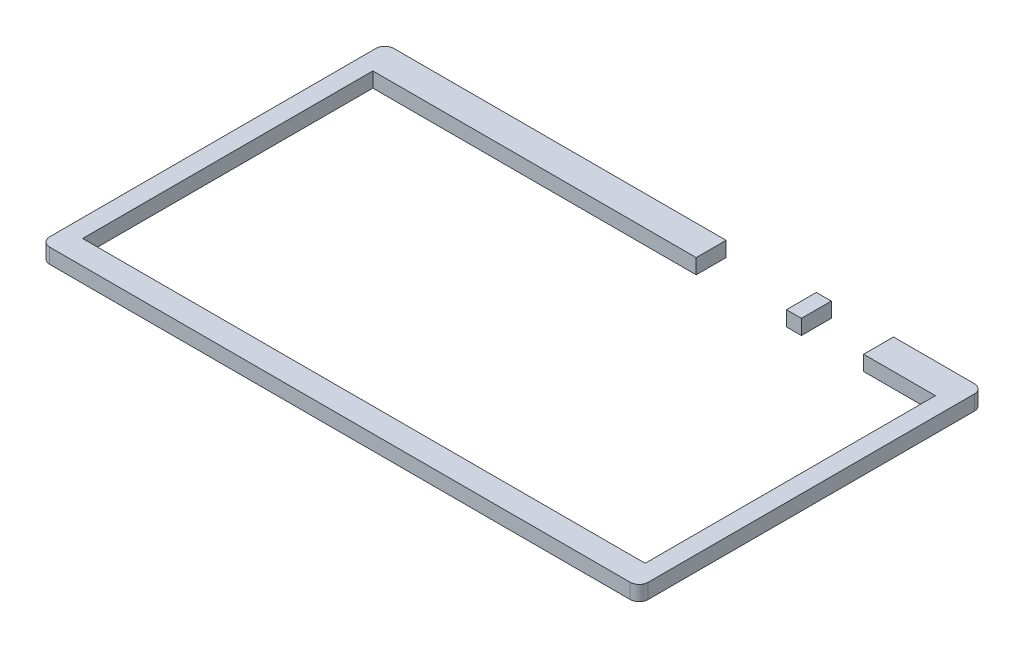
ISO-10303-21;
HEADER;
FILE_DESCRIPTION(('STEP AP214'),'2;1');
FILE_NAME('part.step','',(''),(''),'','','');
FILE_SCHEMA(('AUTOMOTIVE_DESIGN { 1 0 10303 214 1 1 1 1 }'));
ENDSEC;
DATA;
#1=APPLICATION_CONTEXT('core data for automotive mechanical design processes');
#2=APPLICATION_PROTOCOL_DEFINITION('international standard','automotive_design',2000,#1);
#3=PRODUCT_CONTEXT('',#1,'mechanical');
#4=PRODUCT('Part','Part','',(#3));
#5=PRODUCT_RELATED_PRODUCT_CATEGORY('part','',(#4));
#6=PRODUCT_DEFINITION_FORMATION('','',#4);
#7=PRODUCT_DEFINITION_CONTEXT('part definition',#1,'design');
#8=PRODUCT_DEFINITION('design','',#6,#7);
#9=PRODUCT_DEFINITION_SHAPE('','',#8);
#10=(LENGTH_UNIT() NAMED_UNIT(*) SI_UNIT(.MILLI.,.METRE.));
#11=(NAMED_UNIT(*) PLANE_ANGLE_UNIT() SI_UNIT($,.RADIAN.));
#12=(NAMED_UNIT(*) SI_UNIT($,.STERADIAN.) SOLID_ANGLE_UNIT());
#13=UNCERTAINTY_MEASURE_WITH_UNIT(LENGTH_MEASURE(1.E-05),#10,'distance_accuracy_value','');
#14=(GEOMETRIC_REPRESENTATION_CONTEXT(3) GLOBAL_UNCERTAINTY_ASSIGNED_CONTEXT((#13)) GLOBAL_UNIT_ASSIGNED_CONTEXT((#10,
#11,#12)) REPRESENTATION_CONTEXT('',''));
#15=CARTESIAN_POINT('',(0.,0.,0.));
#16=DIRECTION('',(0.,0.,1.));
#17=DIRECTION('',(1.,0.,0.));
#18=AXIS2_PLACEMENT_3D('',#15,#16,#17);
#19=CARTESIAN_POINT('',(189.5,6.35,-146.05));
#20=DIRECTION('',(-1.,0.,0.));
#21=DIRECTION('',(0.,0.,1.));
#22=AXIS2_PLACEMENT_3D('',#19,#20,#21);
#23=PLANE('',#22);
#24=DIRECTION('',(0.,0.,-1.));
#25=VECTOR('',#24,1.);
#26=CARTESIAN_POINT('',(189.5,0.,-146.05));
#27=LINE('',#26,#25);
#28=CARTESIAN_POINT('',(189.5,0.,-133.35));
#29=VERTEX_POINT('',#28);
#30=CARTESIAN_POINT('',(189.5,0.,-146.05));
#31=VERTEX_POINT('',#30);
#32=EDGE_CURVE('E107',#29,#31,#27,.T.);
#33=ORIENTED_EDGE('',*,*,#32,.T.);
#34=DIRECTION('',(0.,-1.,0.));
#35=VECTOR('',#34,1.);
#36=CARTESIAN_POINT('',(189.5,6.35,-146.05));
#37=LINE('',#36,#35);
#38=CARTESIAN_POINT('',(189.5,6.35,-146.05));
#39=VERTEX_POINT('',#38);
#40=EDGE_CURVE('E12',#39,#31,#37,.T.);
#41=ORIENTED_EDGE('',*,*,#40,.F.);
#42=DIRECTION('',(0.,0.,-1.));
#43=VECTOR('',#42,1.);
#44=CARTESIAN_POINT('',(189.5,6.35,-146.05));
#45=LINE('',#44,#43);
#46=CARTESIAN_POINT('',(189.5,6.35,-133.35));
#47=VERTEX_POINT('',#46);
#48=EDGE_CURVE('E95',#47,#39,#45,.T.);
#49=ORIENTED_EDGE('',*,*,#48,.F.);
#50=DIRECTION('',(0.,-1.,0.));
#51=VECTOR('',#50,1.);
#52=CARTESIAN_POINT('',(189.5,6.35,-133.35));
#53=LINE('',#52,#51);
#54=EDGE_CURVE('E103',#47,#29,#53,.T.);
#55=ORIENTED_EDGE('',*,*,#54,.T.);
#56=EDGE_LOOP('',(#33,#41,#49,#55));
#57=FACE_BOUND('',#56,.T.);
#58=ADVANCED_FACE('F44',(#57),#23,.F.);
#59=CARTESIAN_POINT('',(183.15,6.35,-146.05));
#60=DIRECTION('',(0.,0.,1.));
#61=DIRECTION('',(1.,0.,0.));
#62=AXIS2_PLACEMENT_3D('',#59,#60,#61);
#63=PLANE('',#62);
#64=DIRECTION('',(-1.,0.,0.));
#65=VECTOR('',#64,1.);
#66=CARTESIAN_POINT('',(183.15,0.,-146.05));
#67=LINE('',#66,#65);
#68=CARTESIAN_POINT('',(183.15,0.,-146.05));
#69=VERTEX_POINT('',#68);
#70=EDGE_CURVE('E99',#31,#69,#67,.T.);
#71=ORIENTED_EDGE('',*,*,#70,.T.);
#72=DIRECTION('',(0.,-1.,0.));
#73=VECTOR('',#72,1.);
#74=CARTESIAN_POINT('',(183.15,6.35,-146.05));
#75=LINE('',#74,#73);
#76=CARTESIAN_POINT('',(183.15,6.35,-146.05));
#77=VERTEX_POINT('',#76);
#78=EDGE_CURVE('E52',#77,#69,#75,.T.);
#79=ORIENTED_EDGE('',*,*,#78,.F.);
#80=DIRECTION('',(-1.,0.,0.));
#81=VECTOR('',#80,1.);
#82=CARTESIAN_POINT('',(183.15,6.35,-146.05));
#83=LINE('',#82,#81);
#84=EDGE_CURVE('E90',#39,#77,#83,.T.);
#85=ORIENTED_EDGE('',*,*,#84,.F.);
#86=ORIENTED_EDGE('',*,*,#40,.T.);
#87=EDGE_LOOP('',(#71,#79,#85,#86));
#88=FACE_BOUND('',#87,.T.);
#89=ADVANCED_FACE('F98',(#88),#63,.F.);
#90=CARTESIAN_POINT('',(183.15,6.35,-146.05));
#91=DIRECTION('',(1.,0.,0.));
#92=DIRECTION('',(0.,0.,-1.));
#93=AXIS2_PLACEMENT_3D('',#90,#91,#92);
#94=PLANE('',#93);
#95=DIRECTION('',(0.,0.,1.));
#96=VECTOR('',#95,1.);
#97=CARTESIAN_POINT('',(183.15,0.,-146.05));
#98=LINE('',#97,#96);
#99=CARTESIAN_POINT('',(183.15,0.,-133.35));
#100=VERTEX_POINT('',#99);
#101=EDGE_CURVE('E77',#69,#100,#98,.T.);
#102=ORIENTED_EDGE('',*,*,#101,.T.);
#103=DIRECTION('',(0.,-1.,0.));
#104=VECTOR('',#103,1.);
#105=CARTESIAN_POINT('',(183.15,6.35,-133.35));
#106=LINE('',#105,#104);
#107=CARTESIAN_POINT('',(183.15,6.35,-133.35));
#108=VERTEX_POINT('',#107);
#109=EDGE_CURVE('E100',#108,#100,#106,.T.);
#110=ORIENTED_EDGE('',*,*,#109,.F.);
#111=DIRECTION('',(0.,0.,1.));
#112=VECTOR('',#111,1.);
#113=CARTESIAN_POINT('',(183.15,6.35,-146.05));
#114=LINE('',#113,#112);
#115=EDGE_CURVE('E93',#77,#108,#114,.T.);
#116=ORIENTED_EDGE('',*,*,#115,.F.);
#117=ORIENTED_EDGE('',*,*,#78,.T.);
#118=EDGE_LOOP('',(#102,#110,#116,#117));
#119=FACE_BOUND('',#118,.T.);
#120=ADVANCED_FACE('F101',(#119),#94,.F.);
#121=CARTESIAN_POINT('',(183.15,6.35,-133.35));
#122=DIRECTION('',(0.,0.,-1.));
#123=DIRECTION('',(-1.,0.,0.));
#124=AXIS2_PLACEMENT_3D('',#121,#122,#123);
#125=PLANE('',#124);
#126=DIRECTION('',(1.,0.,0.));
#127=VECTOR('',#126,1.);
#128=CARTESIAN_POINT('',(183.15,0.,-133.35));
#129=LINE('',#128,#127);
#130=EDGE_CURVE('E83',#100,#29,#129,.T.);
#131=ORIENTED_EDGE('',*,*,#130,.T.);
#132=ORIENTED_EDGE('',*,*,#54,.F.);
#133=DIRECTION('',(1.,0.,0.));
#134=VECTOR('',#133,1.);
#135=CARTESIAN_POINT('',(183.15,6.35,-133.35));
#136=LINE('',#135,#134);
#137=EDGE_CURVE('E60',#108,#47,#136,.T.);
#138=ORIENTED_EDGE('',*,*,#137,.F.);
#139=ORIENTED_EDGE('',*,*,#109,.T.);
#140=EDGE_LOOP('',(#131,#132,#138,#139));
#141=FACE_BOUND('',#140,.T.);
#142=ADVANCED_FACE('F114',(#141),#125,.F.);
#143=CARTESIAN_POINT('',(0.,6.35,0.));
#144=DIRECTION('',(0.,1.,0.));
#145=DIRECTION('',(0.,0.,1.));
#146=AXIS2_PLACEMENT_3D('',#143,#144,#145);
#147=PLANE('',#146);
#148=ORIENTED_EDGE('',*,*,#48,.T.);
#149=ORIENTED_EDGE('',*,*,#84,.T.);
#150=ORIENTED_EDGE('',*,*,#115,.T.);
#151=ORIENTED_EDGE('',*,*,#137,.T.);
#152=EDGE_LOOP('',(#148,#149,#150,#151));
#153=FACE_BOUND('',#152,.T.);
#154=ADVANCED_FACE('F91',(#153),#147,.T.);
#155=CARTESIAN_POINT('',(0.,0.,0.));
#156=DIRECTION('',(0.,1.,0.));
#157=DIRECTION('',(0.,0.,1.));
#158=AXIS2_PLACEMENT_3D('',#155,#156,#157);
#159=PLANE('',#158);
#160=ORIENTED_EDGE('',*,*,#32,.F.);
#161=ORIENTED_EDGE('',*,*,#130,.F.);
#162=ORIENTED_EDGE('',*,*,#101,.F.);
#163=ORIENTED_EDGE('',*,*,#70,.F.);
#164=EDGE_LOOP('',(#160,#161,#162,#163));
#165=FACE_BOUND('',#164,.T.);
#166=ADVANCED_FACE('F117',(#165),#159,.F.);
#167=CLOSED_SHELL('',(#58,#89,#120,#142,#154,#166));
#168=MANIFOLD_SOLID_BREP('B2',#167);
#169=CARTESIAN_POINT('',(7.62,6.35,-133.35));
#170=DIRECTION('',(-1.,0.,0.));
#171=DIRECTION('',(0.,0.,1.));
#172=AXIS2_PLACEMENT_3D('',#169,#170,#171);
#173=PLANE('',#172);
#174=DIRECTION('',(0.,0.,-1.));
#175=VECTOR('',#174,1.);
#176=CARTESIAN_POINT('',(7.62,0.,-133.35));
#177=LINE('',#176,#175);
#178=CARTESIAN_POINT('',(7.62000000000001,0.,-10.16));
#179=VERTEX_POINT('',#178);
#180=CARTESIAN_POINT('',(7.62,0.,-133.35));
#181=VERTEX_POINT('',#180);
#182=EDGE_CURVE('E311',#179,#181,#177,.T.);
#183=ORIENTED_EDGE('',*,*,#182,.T.);
#184=DIRECTION('',(0.,-1.,0.));
#185=VECTOR('',#184,1.);
#186=CARTESIAN_POINT('',(7.62,6.35,-133.35));
#187=LINE('',#186,#185);
#188=CARTESIAN_POINT('',(7.62,6.35,-133.35));
#189=VERTEX_POINT('',#188);
#190=EDGE_CURVE('E42',#189,#181,#187,.T.);
#191=ORIENTED_EDGE('',*,*,#190,.F.);
#192=DIRECTION('',(0.,0.,-1.));
#193=VECTOR('',#192,1.);
#194=CARTESIAN_POINT('',(7.62,6.35,-133.35));
#195=LINE('',#194,#193);
#196=CARTESIAN_POINT('',(7.62000000000001,6.35,-10.16));
#197=VERTEX_POINT('',#196);
#198=EDGE_CURVE('E341',#197,#189,#195,.T.);
#199=ORIENTED_EDGE('',*,*,#198,.F.);
#200=DIRECTION('',(0.,-1.,0.));
#201=VECTOR('',#200,1.);
#202=CARTESIAN_POINT('',(7.62000000000001,6.35,-10.16));
#203=LINE('',#202,#201);
#204=EDGE_CURVE('E307',#197,#179,#203,.T.);
#205=ORIENTED_EDGE('',*,*,#204,.T.);
#206=EDGE_LOOP('',(#183,#191,#199,#205));
#207=FACE_BOUND('',#206,.T.);
#208=ADVANCED_FACE('F167',(#207),#173,.F.);
#209=CARTESIAN_POINT('',(7.62,6.35,-133.35));
#210=DIRECTION('',(0.,0.,-1.));
#211=DIRECTION('',(-1.,0.,0.));
#212=AXIS2_PLACEMENT_3D('',#209,#210,#211);
#213=PLANE('',#212);
#214=DIRECTION('',(1.,0.,0.));
#215=VECTOR('',#214,1.);
#216=CARTESIAN_POINT('',(7.62,0.,-133.35));
#217=LINE('',#216,#215);
#218=CARTESIAN_POINT('',(144.85,0.,-133.35));
#219=VERTEX_POINT('',#218);
#220=EDGE_CURVE('E314',#181,#219,#217,.T.);
#221=ORIENTED_EDGE('',*,*,#220,.T.);
#222=DIRECTION('',(0.,-1.,0.));
#223=VECTOR('',#222,1.);
#224=CARTESIAN_POINT('',(144.85,6.35,-133.35));
#225=LINE('',#224,#223);
#226=CARTESIAN_POINT('',(144.85,6.35,-133.35));
#227=VERTEX_POINT('',#226);
#228=EDGE_CURVE('E175',#227,#219,#225,.T.);
#229=ORIENTED_EDGE('',*,*,#228,.F.);
#230=DIRECTION('',(1.,0.,0.));
#231=VECTOR('',#230,1.);
#232=CARTESIAN_POINT('',(7.62,6.35,-133.35));
#233=LINE('',#232,#231);
#234=EDGE_CURVE('E250',#189,#227,#233,.T.);
#235=ORIENTED_EDGE('',*,*,#234,.F.);
#236=ORIENTED_EDGE('',*,*,#190,.T.);
#237=EDGE_LOOP('',(#221,#229,#235,#236));
#238=FACE_BOUND('',#237,.T.);
#239=ADVANCED_FACE('F439',(#238),#213,.F.);
#240=CARTESIAN_POINT('',(144.85,6.35,-146.05));
#241=DIRECTION('',(-1.,0.,0.));
#242=DIRECTION('',(0.,0.,1.));
#243=AXIS2_PLACEMENT_3D('',#240,#241,#242);
#244=PLANE('',#243);
#245=DIRECTION('',(0.,0.,-1.));
#246=VECTOR('',#245,1.);
#247=CARTESIAN_POINT('',(144.85,0.,-146.05));
#248=LINE('',#247,#246);
#249=CARTESIAN_POINT('',(144.85,0.,-146.05));
#250=VERTEX_POINT('',#249);
#251=EDGE_CURVE('E316',#219,#250,#248,.T.);
#252=ORIENTED_EDGE('',*,*,#251,.T.);
#253=DIRECTION('',(0.,-1.,0.));
#254=VECTOR('',#253,1.);
#255=CARTESIAN_POINT('',(144.85,6.35,-146.05));
#256=LINE('',#255,#254);
#257=CARTESIAN_POINT('',(144.85,6.35,-146.05));
#258=VERTEX_POINT('',#257);
#259=EDGE_CURVE('E372',#258,#250,#256,.T.);
#260=ORIENTED_EDGE('',*,*,#259,.F.);
#261=DIRECTION('',(0.,0.,-1.));
#262=VECTOR('',#261,1.);
#263=CARTESIAN_POINT('',(144.85,6.35,-146.05));
#264=LINE('',#263,#262);
#265=EDGE_CURVE('E380',#227,#258,#264,.T.);
#266=ORIENTED_EDGE('',*,*,#265,.F.);
#267=ORIENTED_EDGE('',*,*,#228,.T.);
#268=EDGE_LOOP('',(#252,#260,#266,#267));
#269=FACE_BOUND('',#268,.T.);
#270=ADVANCED_FACE('F378',(#269),#244,.F.);
#271=CARTESIAN_POINT('',(3.81,6.35,-146.05));
#272=DIRECTION('',(0.,0.,1.));
#273=DIRECTION('',(1.,0.,0.));
#274=AXIS2_PLACEMENT_3D('',#271,#272,#273);
#275=PLANE('',#274);
#276=DIRECTION('',(-1.,0.,0.));
#277=VECTOR('',#276,1.);
#278=CARTESIAN_POINT('',(3.81,0.,-146.05));
#279=LINE('',#278,#277);
#280=CARTESIAN_POINT('',(3.81,0.,-146.05));
#281=VERTEX_POINT('',#280);
#282=EDGE_CURVE('E318',#250,#281,#279,.T.);
#283=ORIENTED_EDGE('',*,*,#282,.T.);
#284=DIRECTION('',(0.,-1.,0.));
#285=VECTOR('',#284,1.);
#286=CARTESIAN_POINT('',(3.81,6.35,-146.05));
#287=LINE('',#286,#285);
#288=CARTESIAN_POINT('',(3.81,6.35,-146.05));
#289=VERTEX_POINT('',#288);
#290=EDGE_CURVE('E369',#289,#281,#287,.T.);
#291=ORIENTED_EDGE('',*,*,#290,.F.);
#292=DIRECTION('',(-1.,0.,0.));
#293=VECTOR('',#292,1.);
#294=CARTESIAN_POINT('',(3.81,6.35,-146.05));
#295=LINE('',#294,#293);
#296=EDGE_CURVE('E398',#258,#289,#295,.T.);
#297=ORIENTED_EDGE('',*,*,#296,.F.);
#298=ORIENTED_EDGE('',*,*,#259,.T.);
#299=EDGE_LOOP('',(#283,#291,#297,#298));
#300=FACE_BOUND('',#299,.T.);
#301=ADVANCED_FACE('F389',(#300),#275,.F.);
#302=CARTESIAN_POINT('',(3.81,6.35,-142.24));
#303=DIRECTION('',(0.,-1.,0.));
#304=DIRECTION('',(0.,0.,-1.));
#305=AXIS2_PLACEMENT_3D('',#302,#303,#304);
#306=CYLINDRICAL_SURFACE('',#305,3.81);
#307=CARTESIAN_POINT('',(3.81,0.,-142.24));
#308=DIRECTION('',(0.,1.,0.));
#309=DIRECTION('',(0.,0.,-1.));
#310=AXIS2_PLACEMENT_3D('',#307,#308,#309);
#311=CIRCLE('',#310,3.81);
#312=CARTESIAN_POINT('',(0.,0.,-142.24));
#313=VERTEX_POINT('',#312);
#314=EDGE_CURVE('E320',#281,#313,#311,.T.);
#315=ORIENTED_EDGE('',*,*,#314,.T.);
#316=DIRECTION('',(0.,-1.,0.));
#317=VECTOR('',#316,1.);
#318=CARTESIAN_POINT('',(0.,6.35,-142.24));
#319=LINE('',#318,#317);
#320=CARTESIAN_POINT('',(0.,6.35,-142.24));
#321=VERTEX_POINT('',#320);
#322=EDGE_CURVE('E366',#321,#313,#319,.T.);
#323=ORIENTED_EDGE('',*,*,#322,.F.);
#324=CARTESIAN_POINT('',(3.81,6.35,-142.24));
#325=DIRECTION('',(0.,1.,0.));
#326=DIRECTION('',(0.,0.,-1.));
#327=AXIS2_PLACEMENT_3D('',#324,#325,#326);
#328=CIRCLE('',#327,3.81);
#329=EDGE_CURVE('E395',#289,#321,#328,.T.);
#330=ORIENTED_EDGE('',*,*,#329,.F.);
#331=ORIENTED_EDGE('',*,*,#290,.T.);
#332=EDGE_LOOP('',(#315,#323,#330,#331));
#333=FACE_BOUND('',#332,.T.);
#334=ADVANCED_FACE('F393',(#333),#306,.T.);
#335=CARTESIAN_POINT('',(0.,6.35,-3.81000000000003));
#336=DIRECTION('',(1.,0.,0.));
#337=DIRECTION('',(0.,0.,-1.));
#338=AXIS2_PLACEMENT_3D('',#335,#336,#337);
#339=PLANE('',#338);
#340=DIRECTION('',(0.,0.,1.));
#341=VECTOR('',#340,1.);
#342=CARTESIAN_POINT('',(0.,0.,-3.81000000000003));
#343=LINE('',#342,#341);
#344=CARTESIAN_POINT('',(0.,0.,-3.81000000000003));
#345=VERTEX_POINT('',#344);
#346=EDGE_CURVE('E322',#313,#345,#343,.T.);
#347=ORIENTED_EDGE('',*,*,#346,.T.);
#348=DIRECTION('',(0.,-1.,0.));
#349=VECTOR('',#348,1.);
#350=CARTESIAN_POINT('',(0.,6.35,-3.81000000000003));
#351=LINE('',#350,#349);
#352=CARTESIAN_POINT('',(0.,6.35,-3.81000000000003));
#353=VERTEX_POINT('',#352);
#354=EDGE_CURVE('E363',#353,#345,#351,.T.);
#355=ORIENTED_EDGE('',*,*,#354,.F.);
#356=DIRECTION('',(0.,0.,1.));
#357=VECTOR('',#356,1.);
#358=CARTESIAN_POINT('',(0.,6.35,-3.81000000000003));
#359=LINE('',#358,#357);
#360=EDGE_CURVE('E397',#321,#353,#359,.T.);
#361=ORIENTED_EDGE('',*,*,#360,.F.);
#362=ORIENTED_EDGE('',*,*,#322,.T.);
#363=EDGE_LOOP('',(#347,#355,#361,#362));
#364=FACE_BOUND('',#363,.T.);
#365=ADVANCED_FACE('F452',(#364),#339,.F.);
#366=CARTESIAN_POINT('',(3.81,6.35,-3.81));
#367=DIRECTION('',(0.,-1.,0.));
#368=DIRECTION('',(0.,0.,-1.));
#369=AXIS2_PLACEMENT_3D('',#366,#367,#368);
#370=CYLINDRICAL_SURFACE('',#369,3.81);
#371=CARTESIAN_POINT('',(3.81,0.,-3.81));
#372=DIRECTION('',(0.,1.,0.));
#373=DIRECTION('',(0.,0.,-1.));
#374=AXIS2_PLACEMENT_3D('',#371,#372,#373);
#375=CIRCLE('',#374,3.81);
#376=CARTESIAN_POINT('',(3.81000000000003,0.,0.));
#377=VERTEX_POINT('',#376);
#378=EDGE_CURVE('E324',#345,#377,#375,.T.);
#379=ORIENTED_EDGE('',*,*,#378,.T.);
#380=DIRECTION('',(0.,-1.,0.));
#381=VECTOR('',#380,1.);
#382=CARTESIAN_POINT('',(3.81000000000003,6.35,0.));
#383=LINE('',#382,#381);
#384=CARTESIAN_POINT('',(3.81000000000003,6.35,0.));
#385=VERTEX_POINT('',#384);
#386=EDGE_CURVE('E360',#385,#377,#383,.T.);
#387=ORIENTED_EDGE('',*,*,#386,.F.);
#388=CARTESIAN_POINT('',(3.81,6.35,-3.81));
#389=DIRECTION('',(0.,1.,0.));
#390=DIRECTION('',(0.,0.,-1.));
#391=AXIS2_PLACEMENT_3D('',#388,#389,#390);
#392=CIRCLE('',#391,3.81);
#393=EDGE_CURVE('E400',#353,#385,#392,.T.);
#394=ORIENTED_EDGE('',*,*,#393,.F.);
#395=ORIENTED_EDGE('',*,*,#354,.T.);
#396=EDGE_LOOP('',(#379,#387,#394,#395));
#397=FACE_BOUND('',#396,.T.);
#398=ADVANCED_FACE('F455',(#397),#370,.T.);
#399=CARTESIAN_POINT('',(3.81000000000003,6.35,0.));
#400=DIRECTION('',(0.,0.,-1.));
#401=DIRECTION('',(-1.,0.,0.));
#402=AXIS2_PLACEMENT_3D('',#399,#400,#401);
#403=PLANE('',#402);
#404=DIRECTION('',(1.,0.,0.));
#405=VECTOR('',#404,1.);
#406=CARTESIAN_POINT('',(3.81000000000003,0.,0.));
#407=LINE('',#406,#405);
#408=CARTESIAN_POINT('',(250.19,0.,0.));
#409=VERTEX_POINT('',#408);
#410=EDGE_CURVE('E326',#377,#409,#407,.T.);
#411=ORIENTED_EDGE('',*,*,#410,.T.);
#412=DIRECTION('',(0.,-1.,0.));
#413=VECTOR('',#412,1.);
#414=CARTESIAN_POINT('',(250.19,6.35,0.));
#415=LINE('',#414,#413);
#416=CARTESIAN_POINT('',(250.19,6.35,0.));
#417=VERTEX_POINT('',#416);
#418=EDGE_CURVE('E357',#417,#409,#415,.T.);
#419=ORIENTED_EDGE('',*,*,#418,.F.);
#420=DIRECTION('',(1.,0.,0.));
#421=VECTOR('',#420,1.);
#422=CARTESIAN_POINT('',(3.81000000000003,6.35,0.));
#423=LINE('',#422,#421);
#424=EDGE_CURVE('E406',#385,#417,#423,.T.);
#425=ORIENTED_EDGE('',*,*,#424,.F.);
#426=ORIENTED_EDGE('',*,*,#386,.T.);
#427=EDGE_LOOP('',(#411,#419,#425,#426));
#428=FACE_BOUND('',#427,.T.);
#429=ADVANCED_FACE('F459',(#428),#403,.F.);
#430=CARTESIAN_POINT('',(250.19,6.35,-3.81));
#431=DIRECTION('',(0.,-1.,0.));
#432=DIRECTION('',(0.,0.,-1.));
#433=AXIS2_PLACEMENT_3D('',#430,#431,#432);
#434=CYLINDRICAL_SURFACE('',#433,3.80999999999999);
#435=CARTESIAN_POINT('',(250.19,0.,-3.81));
#436=DIRECTION('',(0.,1.,0.));
#437=DIRECTION('',(0.,0.,1.));
#438=AXIS2_PLACEMENT_3D('',#435,#436,#437);
#439=CIRCLE('',#438,3.80999999999999);
#440=CARTESIAN_POINT('',(254.,0.,-3.81));
#441=VERTEX_POINT('',#440);
#442=EDGE_CURVE('E328',#409,#441,#439,.T.);
#443=ORIENTED_EDGE('',*,*,#442,.T.);
#444=DIRECTION('',(0.,-1.,0.));
#445=VECTOR('',#444,1.);
#446=CARTESIAN_POINT('',(254.,6.35,-3.81));
#447=LINE('',#446,#445);
#448=CARTESIAN_POINT('',(254.,6.35,-3.81));
#449=VERTEX_POINT('',#448);
#450=EDGE_CURVE('E354',#449,#441,#447,.T.);
#451=ORIENTED_EDGE('',*,*,#450,.F.);
#452=CARTESIAN_POINT('',(250.19,6.35,-3.81));
#453=DIRECTION('',(0.,1.,0.));
#454=DIRECTION('',(0.,0.,1.));
#455=AXIS2_PLACEMENT_3D('',#452,#453,#454);
#456=CIRCLE('',#455,3.80999999999999);
#457=EDGE_CURVE('E408',#417,#449,#456,.T.);
#458=ORIENTED_EDGE('',*,*,#457,.F.);
#459=ORIENTED_EDGE('',*,*,#418,.T.);
#460=EDGE_LOOP('',(#443,#451,#458,#459));
#461=FACE_BOUND('',#460,.T.);
#462=ADVANCED_FACE('F463',(#461),#434,.T.);
#463=CARTESIAN_POINT('',(254.,6.35,-3.81));
#464=DIRECTION('',(-1.,0.,0.));
#465=DIRECTION('',(0.,0.,1.));
#466=AXIS2_PLACEMENT_3D('',#463,#464,#465);
#467=PLANE('',#466);
#468=DIRECTION('',(0.,0.,-1.));
#469=VECTOR('',#468,1.);
#470=CARTESIAN_POINT('',(254.,0.,-3.81));
#471=LINE('',#470,#469);
#472=CARTESIAN_POINT('',(254.,0.,-142.24));
#473=VERTEX_POINT('',#472);
#474=EDGE_CURVE('E330',#441,#473,#471,.T.);
#475=ORIENTED_EDGE('',*,*,#474,.T.);
#476=DIRECTION('',(0.,-1.,0.));
#477=VECTOR('',#476,1.);
#478=CARTESIAN_POINT('',(254.,6.35,-142.24));
#479=LINE('',#478,#477);
#480=CARTESIAN_POINT('',(254.,6.35,-142.24));
#481=VERTEX_POINT('',#480);
#482=EDGE_CURVE('E351',#481,#473,#479,.T.);
#483=ORIENTED_EDGE('',*,*,#482,.F.);
#484=DIRECTION('',(0.,0.,-1.));
#485=VECTOR('',#484,1.);
#486=CARTESIAN_POINT('',(254.,6.35,-3.81));
#487=LINE('',#486,#485);
#488=EDGE_CURVE('E410',#449,#481,#487,.T.);
#489=ORIENTED_EDGE('',*,*,#488,.F.);
#490=ORIENTED_EDGE('',*,*,#450,.T.);
#491=EDGE_LOOP('',(#475,#483,#489,#490));
#492=FACE_BOUND('',#491,.T.);
#493=ADVANCED_FACE('F467',(#492),#467,.F.);
#494=CARTESIAN_POINT('',(250.19,6.35,-142.24));
#495=DIRECTION('',(0.,-1.,0.));
#496=DIRECTION('',(0.,0.,-1.));
#497=AXIS2_PLACEMENT_3D('',#494,#495,#496);
#498=CYLINDRICAL_SURFACE('',#497,3.81000000000002);
#499=CARTESIAN_POINT('',(250.19,0.,-142.24));
#500=DIRECTION('',(0.,1.,0.));
#501=DIRECTION('',(0.,0.,-1.));
#502=AXIS2_PLACEMENT_3D('',#499,#500,#501);
#503=CIRCLE('',#502,3.81000000000002);
#504=CARTESIAN_POINT('',(250.19,0.,-146.05));
#505=VERTEX_POINT('',#504);
#506=EDGE_CURVE('E332',#473,#505,#503,.T.);
#507=ORIENTED_EDGE('',*,*,#506,.T.);
#508=DIRECTION('',(0.,-1.,0.));
#509=VECTOR('',#508,1.);
#510=CARTESIAN_POINT('',(250.19,6.35,-146.05));
#511=LINE('',#510,#509);
#512=CARTESIAN_POINT('',(250.19,6.35,-146.05));
#513=VERTEX_POINT('',#512);
#514=EDGE_CURVE('E348',#513,#505,#511,.T.);
#515=ORIENTED_EDGE('',*,*,#514,.F.);
#516=CARTESIAN_POINT('',(250.19,6.35,-142.24));
#517=DIRECTION('',(0.,1.,0.));
#518=DIRECTION('',(0.,0.,-1.));
#519=AXIS2_PLACEMENT_3D('',#516,#517,#518);
#520=CIRCLE('',#519,3.81000000000002);
#521=EDGE_CURVE('E412',#481,#513,#520,.T.);
#522=ORIENTED_EDGE('',*,*,#521,.F.);
#523=ORIENTED_EDGE('',*,*,#482,.T.);
#524=EDGE_LOOP('',(#507,#515,#522,#523));
#525=FACE_BOUND('',#524,.T.);
#526=ADVANCED_FACE('F471',(#525),#498,.T.);
#527=CARTESIAN_POINT('',(215.9,6.35,-146.05));
#528=DIRECTION('',(0.,0.,1.));
#529=DIRECTION('',(1.,0.,0.));
#530=AXIS2_PLACEMENT_3D('',#527,#528,#529);
#531=PLANE('',#530);
#532=DIRECTION('',(-1.,0.,0.));
#533=VECTOR('',#532,1.);
#534=CARTESIAN_POINT('',(215.9,0.,-146.05));
#535=LINE('',#534,#533);
#536=CARTESIAN_POINT('',(215.9,0.,-146.05));
#537=VERTEX_POINT('',#536);
#538=EDGE_CURVE('E334',#505,#537,#535,.T.);
#539=ORIENTED_EDGE('',*,*,#538,.T.);
#540=DIRECTION('',(0.,-1.,0.));
#541=VECTOR('',#540,1.);
#542=CARTESIAN_POINT('',(215.9,6.35,-146.05));
#543=LINE('',#542,#541);
#544=CARTESIAN_POINT('',(215.9,6.35,-146.05));
#545=VERTEX_POINT('',#544);
#546=EDGE_CURVE('E345',#545,#537,#543,.T.);
#547=ORIENTED_EDGE('',*,*,#546,.F.);
#548=DIRECTION('',(-1.,0.,0.));
#549=VECTOR('',#548,1.);
#550=CARTESIAN_POINT('',(215.9,6.35,-146.05));
#551=LINE('',#550,#549);
#552=EDGE_CURVE('E414',#513,#545,#551,.T.);
#553=ORIENTED_EDGE('',*,*,#552,.F.);
#554=ORIENTED_EDGE('',*,*,#514,.T.);
#555=EDGE_LOOP('',(#539,#547,#553,#554));
#556=FACE_BOUND('',#555,.T.);
#557=ADVANCED_FACE('F420',(#556),#531,.F.);
#558=CARTESIAN_POINT('',(215.9,6.35,-146.05));
#559=DIRECTION('',(1.,0.,0.));
#560=DIRECTION('',(0.,0.,-1.));
#561=AXIS2_PLACEMENT_3D('',#558,#559,#560);
#562=PLANE('',#561);
#563=DIRECTION('',(0.,0.,1.));
#564=VECTOR('',#563,1.);
#565=CARTESIAN_POINT('',(215.9,0.,-146.05));
#566=LINE('',#565,#564);
#567=CARTESIAN_POINT('',(215.9,0.,-133.35));
#568=VERTEX_POINT('',#567);
#569=EDGE_CURVE('E336',#537,#568,#566,.T.);
#570=ORIENTED_EDGE('',*,*,#569,.T.);
#571=DIRECTION('',(0.,-1.,0.));
#572=VECTOR('',#571,1.);
#573=CARTESIAN_POINT('',(215.9,6.35,-133.35));
#574=LINE('',#573,#572);
#575=CARTESIAN_POINT('',(215.9,6.35,-133.35));
#576=VERTEX_POINT('',#575);
#577=EDGE_CURVE('E302',#576,#568,#574,.T.);
#578=ORIENTED_EDGE('',*,*,#577,.F.);
#579=DIRECTION('',(0.,0.,1.));
#580=VECTOR('',#579,1.);
#581=CARTESIAN_POINT('',(215.9,6.35,-146.05));
#582=LINE('',#581,#580);
#583=EDGE_CURVE('E293',#545,#576,#582,.T.);
#584=ORIENTED_EDGE('',*,*,#583,.F.);
#585=ORIENTED_EDGE('',*,*,#546,.T.);
#586=EDGE_LOOP('',(#570,#578,#584,#585));
#587=FACE_BOUND('',#586,.T.);
#588=ADVANCED_FACE('F424',(#587),#562,.F.);
#589=CARTESIAN_POINT('',(215.9,6.35,-133.35));
#590=DIRECTION('',(0.,0.,-1.));
#591=DIRECTION('',(-1.,0.,0.));
#592=AXIS2_PLACEMENT_3D('',#589,#590,#591);
#593=PLANE('',#592);
#594=DIRECTION('',(1.,0.,0.));
#595=VECTOR('',#594,1.);
#596=CARTESIAN_POINT('',(215.9,0.,-133.35));
#597=LINE('',#596,#595);
#598=CARTESIAN_POINT('',(246.38,0.,-133.35));
#599=VERTEX_POINT('',#598);
#600=EDGE_CURVE('E301',#568,#599,#597,.T.);
#601=ORIENTED_EDGE('',*,*,#600,.T.);
#602=DIRECTION('',(0.,-1.,0.));
#603=VECTOR('',#602,1.);
#604=CARTESIAN_POINT('',(246.38,6.35,-133.35));
#605=LINE('',#604,#603);
#606=CARTESIAN_POINT('',(246.38,6.35,-133.35));
#607=VERTEX_POINT('',#606);
#608=EDGE_CURVE('E298',#607,#599,#605,.T.);
#609=ORIENTED_EDGE('',*,*,#608,.F.);
#610=DIRECTION('',(1.,0.,0.));
#611=VECTOR('',#610,1.);
#612=CARTESIAN_POINT('',(215.9,6.35,-133.35));
#613=LINE('',#612,#611);
#614=EDGE_CURVE('E287',#576,#607,#613,.T.);
#615=ORIENTED_EDGE('',*,*,#614,.F.);
#616=ORIENTED_EDGE('',*,*,#577,.T.);
#617=EDGE_LOOP('',(#601,#609,#615,#616));
#618=FACE_BOUND('',#617,.T.);
#619=ADVANCED_FACE('F299',(#618),#593,.F.);
#620=CARTESIAN_POINT('',(246.38,6.35,-133.35));
#621=DIRECTION('',(1.,0.,0.));
#622=DIRECTION('',(0.,0.,-1.));
#623=AXIS2_PLACEMENT_3D('',#620,#621,#622);
#624=PLANE('',#623);
#625=DIRECTION('',(0.,0.,1.));
#626=VECTOR('',#625,1.);
#627=CARTESIAN_POINT('',(246.38,0.,-133.35));
#628=LINE('',#627,#626);
#629=CARTESIAN_POINT('',(246.38,0.,-10.16));
#630=VERTEX_POINT('',#629);
#631=EDGE_CURVE('E236',#599,#630,#628,.T.);
#632=ORIENTED_EDGE('',*,*,#631,.T.);
#633=DIRECTION('',(0.,-1.,0.));
#634=VECTOR('',#633,1.);
#635=CARTESIAN_POINT('',(246.38,6.35,-10.16));
#636=LINE('',#635,#634);
#637=CARTESIAN_POINT('',(246.38,6.35,-10.16));
#638=VERTEX_POINT('',#637);
#639=EDGE_CURVE('E303',#638,#630,#636,.T.);
#640=ORIENTED_EDGE('',*,*,#639,.F.);
#641=DIRECTION('',(0.,0.,1.));
#642=VECTOR('',#641,1.);
#643=CARTESIAN_POINT('',(246.38,6.35,-133.35));
#644=LINE('',#643,#642);
#645=EDGE_CURVE('E291',#607,#638,#644,.T.);
#646=ORIENTED_EDGE('',*,*,#645,.F.);
#647=ORIENTED_EDGE('',*,*,#608,.T.);
#648=EDGE_LOOP('',(#632,#640,#646,#647));
#649=FACE_BOUND('',#648,.T.);
#650=ADVANCED_FACE('F305',(#649),#624,.F.);
#651=CARTESIAN_POINT('',(7.62000000000001,6.35,-10.16));
#652=DIRECTION('',(0.,0.,1.));
#653=DIRECTION('',(1.,0.,0.));
#654=AXIS2_PLACEMENT_3D('',#651,#652,#653);
#655=PLANE('',#654);
#656=DIRECTION('',(-1.,0.,0.));
#657=VECTOR('',#656,1.);
#658=CARTESIAN_POINT('',(7.62000000000001,0.,-10.16));
#659=LINE('',#658,#657);
#660=EDGE_CURVE('E242',#630,#179,#659,.T.);
#661=ORIENTED_EDGE('',*,*,#660,.T.);
#662=ORIENTED_EDGE('',*,*,#204,.F.);
#663=DIRECTION('',(-1.,0.,0.));
#664=VECTOR('',#663,1.);
#665=CARTESIAN_POINT('',(7.62000000000001,6.35,-10.16));
#666=LINE('',#665,#664);
#667=EDGE_CURVE('E183',#638,#197,#666,.T.);
#668=ORIENTED_EDGE('',*,*,#667,.F.);
#669=ORIENTED_EDGE('',*,*,#639,.T.);
#670=EDGE_LOOP('',(#661,#662,#668,#669));
#671=FACE_BOUND('',#670,.T.);
#672=ADVANCED_FACE('F428',(#671),#655,.F.);
#673=CARTESIAN_POINT('',(250.19,6.35,-142.24));
#674=DIRECTION('',(0.,-1.,0.));
#675=DIRECTION('',(0.,0.,-1.));
#676=AXIS2_PLACEMENT_3D('',#673,#674,#675);
#677=PLANE('',#676);
#678=ORIENTED_EDGE('',*,*,#198,.T.);
#679=ORIENTED_EDGE('',*,*,#234,.T.);
#680=ORIENTED_EDGE('',*,*,#265,.T.);
#681=ORIENTED_EDGE('',*,*,#296,.T.);
#682=ORIENTED_EDGE('',*,*,#329,.T.);
#683=ORIENTED_EDGE('',*,*,#360,.T.);
#684=ORIENTED_EDGE('',*,*,#393,.T.);
#685=ORIENTED_EDGE('',*,*,#424,.T.);
#686=ORIENTED_EDGE('',*,*,#457,.T.);
#687=ORIENTED_EDGE('',*,*,#488,.T.);
#688=ORIENTED_EDGE('',*,*,#521,.T.);
#689=ORIENTED_EDGE('',*,*,#552,.T.);
#690=ORIENTED_EDGE('',*,*,#583,.T.);
#691=ORIENTED_EDGE('',*,*,#614,.T.);
#692=ORIENTED_EDGE('',*,*,#645,.T.);
#693=ORIENTED_EDGE('',*,*,#667,.T.);
#694=EDGE_LOOP('',(#678,#679,#680,#681,#682,#683,#684,#685,#686,#687,#688,#689,#690,#691,#692,#693));
#695=FACE_BOUND('',#694,.T.);
#696=ADVANCED_FACE('F289',(#695),#677,.F.);
#697=CARTESIAN_POINT('',(250.19,0.,-142.24));
#698=DIRECTION('',(0.,-1.,0.));
#699=DIRECTION('',(0.,0.,-1.));
#700=AXIS2_PLACEMENT_3D('',#697,#698,#699);
#701=PLANE('',#700);
#702=ORIENTED_EDGE('',*,*,#182,.F.);
#703=ORIENTED_EDGE('',*,*,#660,.F.);
#704=ORIENTED_EDGE('',*,*,#631,.F.);
#705=ORIENTED_EDGE('',*,*,#600,.F.);
#706=ORIENTED_EDGE('',*,*,#569,.F.);
#707=ORIENTED_EDGE('',*,*,#538,.F.);
#708=ORIENTED_EDGE('',*,*,#506,.F.);
#709=ORIENTED_EDGE('',*,*,#474,.F.);
#710=ORIENTED_EDGE('',*,*,#442,.F.);
#711=ORIENTED_EDGE('',*,*,#410,.F.);
#712=ORIENTED_EDGE('',*,*,#378,.F.);
#713=ORIENTED_EDGE('',*,*,#346,.F.);
#714=ORIENTED_EDGE('',*,*,#314,.F.);
#715=ORIENTED_EDGE('',*,*,#282,.F.);
#716=ORIENTED_EDGE('',*,*,#251,.F.);
#717=ORIENTED_EDGE('',*,*,#220,.F.);
#718=EDGE_LOOP('',(#702,#703,#704,#705,#706,#707,#708,#709,#710,#711,#712,#713,#714,#715,#716,#717));
#719=FACE_BOUND('',#718,.T.);
#720=ADVANCED_FACE('F384',(#719),#701,.T.);
#721=CLOSED_SHELL('',(#208,#239,#270,#301,#334,#365,#398,#429,#462,#493,#526,#557,#588,#619,
#650,#672,#696,#720));
#722=MANIFOLD_SOLID_BREP('B6',#721);
#723=ADVANCED_BREP_SHAPE_REPRESENTATION('',(#18,#168,#722),#14);
#724=SHAPE_DEFINITION_REPRESENTATION(#9,#723);
ENDSEC;
END-ISO-10303-21;
